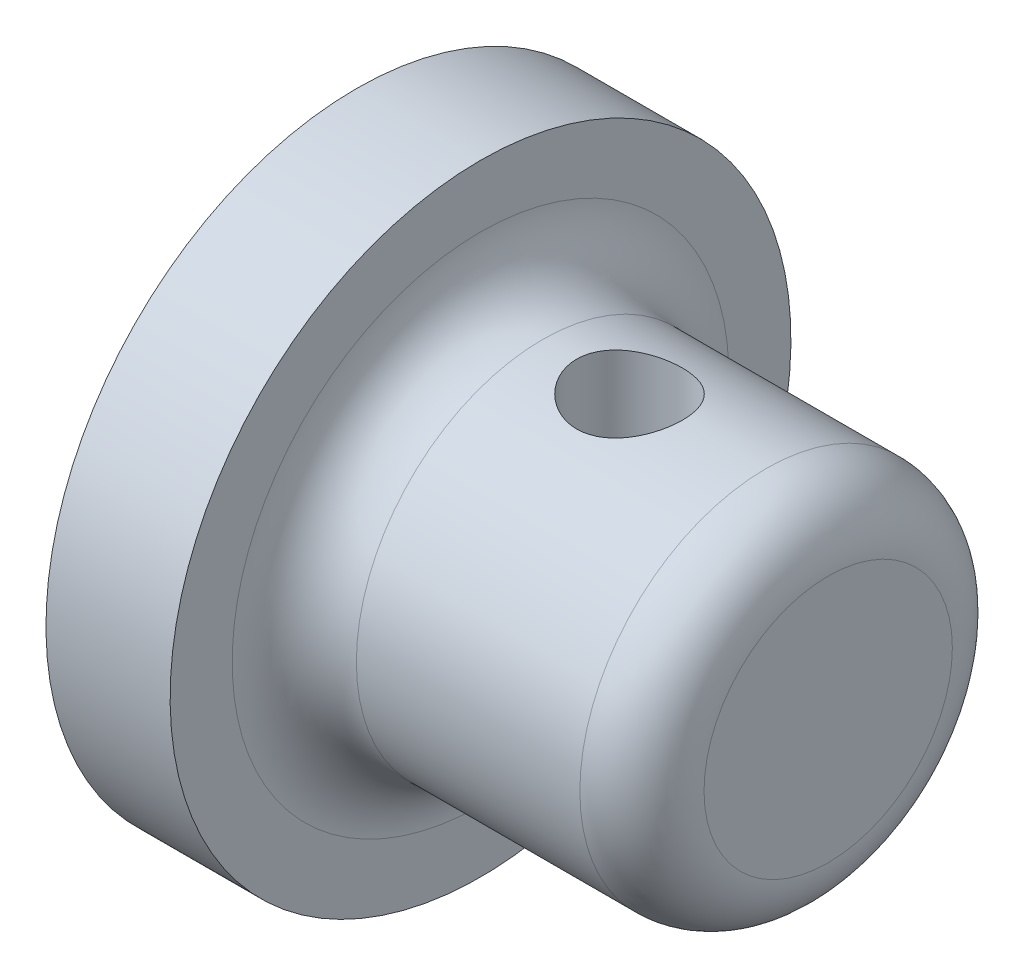
ISO-10303-21;
HEADER;
FILE_DESCRIPTION(('STEP AP214'),'2;1');
FILE_NAME('part.step','',(''),(''),'','','');
FILE_SCHEMA(('AUTOMOTIVE_DESIGN { 1 0 10303 214 1 1 1 1 }'));
ENDSEC;
DATA;
#1=APPLICATION_CONTEXT('core data for automotive mechanical design processes');
#2=APPLICATION_PROTOCOL_DEFINITION('international standard','automotive_design',2000,#1);
#3=PRODUCT_CONTEXT('',#1,'mechanical');
#4=PRODUCT('Part','Part','',(#3));
#5=PRODUCT_RELATED_PRODUCT_CATEGORY('part','',(#4));
#6=PRODUCT_DEFINITION_FORMATION('','',#4);
#7=PRODUCT_DEFINITION_CONTEXT('part definition',#1,'design');
#8=PRODUCT_DEFINITION('design','',#6,#7);
#9=PRODUCT_DEFINITION_SHAPE('','',#8);
#10=(LENGTH_UNIT() NAMED_UNIT(*) SI_UNIT(.MILLI.,.METRE.));
#11=(NAMED_UNIT(*) PLANE_ANGLE_UNIT() SI_UNIT($,.RADIAN.));
#12=(NAMED_UNIT(*) SI_UNIT($,.STERADIAN.) SOLID_ANGLE_UNIT());
#13=UNCERTAINTY_MEASURE_WITH_UNIT(LENGTH_MEASURE(1.E-05),#10,'distance_accuracy_value','');
#14=(GEOMETRIC_REPRESENTATION_CONTEXT(3) GLOBAL_UNCERTAINTY_ASSIGNED_CONTEXT((#13)) GLOBAL_UNIT_ASSIGNED_CONTEXT((#10,
#11,#12)) REPRESENTATION_CONTEXT('',''));
#15=CARTESIAN_POINT('',(0.,0.,0.));
#16=DIRECTION('',(0.,0.,1.));
#17=DIRECTION('',(1.,0.,0.));
#18=AXIS2_PLACEMENT_3D('',#15,#16,#17);
#19=CARTESIAN_POINT('',(24.13,6.34999999999998,0.));
#20=DIRECTION('',(1.,0.,0.));
#21=DIRECTION('',(0.,1.,0.));
#22=AXIS2_PLACEMENT_3D('',#19,#20,#21);
#23=PLANE('',#22);
#24=CARTESIAN_POINT('',(24.13,0.,0.));
#25=DIRECTION('',(1.,0.,0.));
#26=DIRECTION('',(0.,1.,0.));
#27=AXIS2_PLACEMENT_3D('',#24,#25,#26);
#28=CIRCLE('',#27,6.34999999999998);
#29=CARTESIAN_POINT('',(24.13,6.34999999999998,0.));
#30=VERTEX_POINT('',#29);
#31=EDGE_CURVE('E13',#30,#30,#28,.T.);
#32=ORIENTED_EDGE('',*,*,#31,.T.);
#33=EDGE_LOOP('',(#32));
#34=FACE_BOUND('',#33,.T.);
#35=ADVANCED_FACE('F59',(#34),#23,.T.);
#36=CARTESIAN_POINT('',(20.955,0.,0.));
#37=DIRECTION('',(1.,0.,0.));
#38=DIRECTION('',(0.,1.,0.));
#39=AXIS2_PLACEMENT_3D('',#36,#37,#38);
#40=TOROIDAL_SURFACE('',#39,6.35,3.175);
#41=CARTESIAN_POINT('',(20.955,0.,0.));
#42=DIRECTION('',(1.,0.,0.));
#43=DIRECTION('',(0.,1.,0.));
#44=AXIS2_PLACEMENT_3D('',#41,#42,#43);
#45=CIRCLE('',#44,9.525);
#46=CARTESIAN_POINT('',(20.955,9.525,0.));
#47=VERTEX_POINT('',#46);
#48=EDGE_CURVE('E66',#47,#47,#45,.T.);
#49=ORIENTED_EDGE('',*,*,#48,.T.);
#50=EDGE_LOOP('',(#49));
#51=FACE_BOUND('',#50,.T.);
#52=ORIENTED_EDGE('',*,*,#31,.F.);
#53=EDGE_LOOP('',(#52));
#54=FACE_BOUND('',#53,.T.);
#55=ADVANCED_FACE('F122',(#51,#54),#40,.T.);
#56=CARTESIAN_POINT('',(24.13,0.,0.));
#57=DIRECTION('',(1.,0.,0.));
#58=DIRECTION('',(0.,1.,0.));
#59=AXIS2_PLACEMENT_3D('',#56,#57,#58);
#60=CYLINDRICAL_SURFACE('',#59,9.525);
#61=CARTESIAN_POINT('',(11.2649,9.525,0.));
#62=CARTESIAN_POINT('',(11.2649027139598,9.52499818112442,0.148756999916294));
#63=CARTESIAN_POINT('',(11.2772114442681,9.52148136829678,0.297541994727331));
#64=CARTESIAN_POINT('',(11.3260190434138,9.50779462426993,0.590802096886819));
#65=CARTESIAN_POINT('',(11.3625272951013,9.49762211248473,0.735275509796205));
#66=CARTESIAN_POINT('',(11.4584334056819,9.47174264412805,1.0156387449244));
#67=CARTESIAN_POINT('',(11.5177995709198,9.45604335328707,1.15154015034689));
#68=CARTESIAN_POINT('',(11.6576124363739,9.420755493562,1.41145912819135));
#69=CARTESIAN_POINT('',(11.7380612700519,9.40116653111099,1.53547549617066));
#70=CARTESIAN_POINT('',(11.9199625804458,9.3596317541851,1.77132902249801));
#71=CARTESIAN_POINT('',(12.0218625411715,9.33764151138462,1.88281322947987));
#72=CARTESIAN_POINT('',(12.2428184677557,9.29405743568324,2.08736237812629));
#73=CARTESIAN_POINT('',(12.3618769662972,9.2724636618345,2.18042459579446));
#74=CARTESIAN_POINT('',(12.6166729651115,9.23165527466383,2.34727748753855));
#75=CARTESIAN_POINT('',(12.7526942782538,9.21249630041467,2.42064963199244));
#76=CARTESIAN_POINT('',(13.0357757661025,9.17938552638479,2.54333897551483));
#77=CARTESIAN_POINT('',(13.1828335902785,9.16543262158652,2.59266127997999));
#78=CARTESIAN_POINT('',(13.4798762040959,9.14477466733228,2.6646012440702));
#79=CARTESIAN_POINT('',(13.6296921910612,9.13789478730722,2.68786440724308));
#80=CARTESIAN_POINT('',(13.9312462879286,9.13164060874917,2.7090399283611));
#81=CARTESIAN_POINT('',(14.0829839787247,9.132264700897,2.70695772193142));
#82=CARTESIAN_POINT('',(14.3789311439594,9.14079224375529,2.67801129612543));
#83=CARTESIAN_POINT('',(14.5232261747384,9.14846222605159,2.65194185845393));
#84=CARTESIAN_POINT('',(14.8053044207535,9.16984154965303,2.57703957452235));
#85=CARTESIAN_POINT('',(14.943087052398,9.18355143107613,2.52820469243981));
#86=CARTESIAN_POINT('',(15.2102360733593,9.21566137412121,2.40854203178749));
#87=CARTESIAN_POINT('',(15.3394753327523,9.23411806676774,2.33744627513731));
#88=CARTESIAN_POINT('',(15.5844619632318,9.27361322961474,2.17546656004989));
#89=CARTESIAN_POINT('',(15.7002063537613,9.2946522680691,2.08457824277424));
#90=CARTESIAN_POINT('',(15.9194423672558,9.33790080178231,1.8815885139358));
#91=CARTESIAN_POINT('',(16.0223177311978,9.36012471798654,1.76882355323714));
#92=CARTESIAN_POINT('',(16.207832824048,9.40254107733199,1.52736701366854));
#93=CARTESIAN_POINT('',(16.2904715290635,9.42273341765329,1.39867462943139));
#94=CARTESIAN_POINT('',(16.433490103816,9.45896471925581,1.1279784427516));
#95=CARTESIAN_POINT('',(16.49374574329,9.47498035703894,0.985905676513321));
#96=CARTESIAN_POINT('',(16.589332503177,9.50088562646572,0.693085150649756));
#97=CARTESIAN_POINT('',(16.6246698280466,9.51077678298027,0.542339560604574));
#98=CARTESIAN_POINT('',(16.6684198116526,9.52308262952376,0.241701393809074));
#99=CARTESIAN_POINT('',(16.6776689361307,9.52572950732462,0.0919398616075997));
#100=CARTESIAN_POINT('',(16.671307437029,9.52392301879463,-0.206999132800684));
#101=CARTESIAN_POINT('',(16.6556997576006,9.5194704933489,-0.356176662081515));
#102=CARTESIAN_POINT('',(16.6007492351058,9.50411657709512,-0.646640666342629));
#103=CARTESIAN_POINT('',(16.5618842009488,9.49334509107229,-0.788025041101639));
#104=CARTESIAN_POINT('',(16.4620871647328,9.46658636482631,-1.06224499178383));
#105=CARTESIAN_POINT('',(16.4011526239624,9.4505985245737,-1.19507958213246));
#106=CARTESIAN_POINT('',(16.2574701150544,9.41465087528733,-1.45159254029374));
#107=CARTESIAN_POINT('',(16.1742819843645,9.39461317210824,-1.57501315692875));
#108=CARTESIAN_POINT('',(15.9889974220595,9.3528753240453,-1.80643255452915));
#109=CARTESIAN_POINT('',(15.8868967411297,9.33117480620021,-1.91442786002367));
#110=CARTESIAN_POINT('',(15.6627657332477,9.28768360367916,-2.11553781936395));
#111=CARTESIAN_POINT('',(15.5401983484355,9.26591263188579,-2.20805940209002));
#112=CARTESIAN_POINT('',(15.2808083794733,9.22550255819343,-2.37124887253828));
#113=CARTESIAN_POINT('',(15.1439863032124,9.20686334477291,-2.44191753851558));
#114=CARTESIAN_POINT('',(14.860551369766,9.17504490312454,-2.55887729952463));
#115=CARTESIAN_POINT('',(14.7139958856797,9.16183649519369,-2.60529904736666));
#116=CARTESIAN_POINT('',(14.414711630276,9.14240513059007,-2.67269664138985));
#117=CARTESIAN_POINT('',(14.261984715707,9.13618008886282,-2.69368008294949));
#118=CARTESIAN_POINT('',(13.9608086707336,9.13161059173126,-2.70912698738763));
#119=CARTESIAN_POINT('',(13.8124124060783,9.13298091418602,-2.70455023979921));
#120=CARTESIAN_POINT('',(13.518600247693,9.14277082269786,-2.67126583333857));
#121=CARTESIAN_POINT('',(13.3731842568879,9.15119017877477,-2.64255896173012));
#122=CARTESIAN_POINT('',(13.0908506701345,9.17394849705862,-2.56241876389195));
#123=CARTESIAN_POINT('',(12.9538628855709,9.18822769726058,-2.51121451658372));
#124=CARTESIAN_POINT('',(12.6903147521363,9.22109158095282,-2.38771023523766));
#125=CARTESIAN_POINT('',(12.5637562352128,9.23967701867681,-2.31540650506774));
#126=CARTESIAN_POINT('',(12.3201417894333,9.27982563938383,-2.14895545224544));
#127=CARTESIAN_POINT('',(12.2035376950314,9.30146689026007,-2.0541656218296));
#128=CARTESIAN_POINT('',(11.9875795456067,9.34488283001816,-1.84662174734086));
#129=CARTESIAN_POINT('',(11.8882298263015,9.36665755101969,-1.73386320165934));
#130=CARTESIAN_POINT('',(11.7071164822866,9.40854540303318,-1.49015020654805));
#131=CARTESIAN_POINT('',(11.6258601898975,9.42860270326483,-1.35880823337262));
#132=CARTESIAN_POINT('',(11.4867044832368,9.46415696389063,-1.08375849706931));
#133=CARTESIAN_POINT('',(11.4287920952713,9.47965645604969,-0.940057656585436));
#134=CARTESIAN_POINT('',(11.3443402063547,9.50267006063013,-0.664364906766963));
#135=CARTESIAN_POINT('',(11.3146249825079,9.51097871542354,-0.533404088989212));
#136=CARTESIAN_POINT('',(11.274904938873,9.52214415033941,-0.268302827001871));
#137=CARTESIAN_POINT('',(11.2648975523005,9.52500164042996,-0.134162799161774));
#138=CARTESIAN_POINT('',(11.2649,9.525,0.));
#139=B_SPLINE_CURVE_WITH_KNOTS('',3,(#61,#62,#63,#64,#65,#66,#67,#68,#69,#70,#71,#72,#73,#74,
#75,#76,#77,#78,#79,#80,#81,#82,#83,#84,#85,#86,#87,#88,#89,#90,#91,#92,#93,#94,#95,#96,#97,#98,
#99,#100,#101,#102,#103,#104,#105,#106,#107,#108,#109,#110,#111,#112,#113,#114,#115,#116,#117,
#118,#119,#120,#121,#122,#123,#124,#125,#126,#127,#128,#129,#130,#131,#132,#133,#134,#135,#136,
#137,#138),.UNSPECIFIED.,.T.,.F.,(4,2,2,2,2,2,2,2,2,2,2,2,2,2,2,2,2,2,2,2,2,2,2,2,2,2,2,2,2,2,2,
2,2,2,2,2,2,2,4),(0.,0.445778588608764,0.891730119570487,1.33706552998242,1.78244602355233,
2.23824969509093,2.69412071449328,3.1590272915526,3.62383513336237,4.07685555606772,
4.52977882470262,4.9682153636813,5.40669111780621,5.85066253981491,6.29473183497442,
6.75532655956679,7.2159445835686,7.67908222414913,8.14210450648873,8.59010226811034,
9.03804697081134,9.47709047830543,9.91618450613636,10.3647039776081,10.8133243459561,
11.2764301365973,11.7395194326002,12.2000869695865,12.660516956259,13.1037768089245,
13.5470222004591,13.9858552333413,14.4247651856217,14.8781696564047,15.3316878953407,
15.7966563015891,16.2613659378204,16.663462606734,17.0655069023826),.UNSPECIFIED.);
#140=CARTESIAN_POINT('',(11.2649,9.525,0.));
#141=VERTEX_POINT('',#140);
#142=EDGE_CURVE('E99',#141,#141,#139,.T.);
#143=ORIENTED_EDGE('',*,*,#142,.F.);
#144=EDGE_LOOP('',(#143));
#145=FACE_BOUND('',#144,.T.);
#146=CARTESIAN_POINT('',(9.52500000000002,0.,0.));
#147=DIRECTION('',(1.,0.,0.));
#148=DIRECTION('',(0.,1.,0.));
#149=AXIS2_PLACEMENT_3D('',#146,#147,#148);
#150=CIRCLE('',#149,9.525);
#151=CARTESIAN_POINT('',(9.52500000000002,9.525,0.));
#152=VERTEX_POINT('',#151);
#153=EDGE_CURVE('E117',#152,#152,#150,.T.);
#154=ORIENTED_EDGE('',*,*,#153,.T.);
#155=EDGE_LOOP('',(#154));
#156=FACE_BOUND('',#155,.T.);
#157=ORIENTED_EDGE('',*,*,#48,.F.);
#158=EDGE_LOOP('',(#157));
#159=FACE_BOUND('',#158,.T.);
#160=ADVANCED_FACE('F125',(#145,#156,#159),#60,.T.);
#161=CARTESIAN_POINT('',(9.525,0.,0.));
#162=DIRECTION('',(1.,0.,0.));
#163=DIRECTION('',(0.,1.,0.));
#164=AXIS2_PLACEMENT_3D('',#161,#162,#163);
#165=TOROIDAL_SURFACE('',#164,12.7,3.175);
#166=CARTESIAN_POINT('',(6.35,0.,0.));
#167=DIRECTION('',(1.,0.,0.));
#168=DIRECTION('',(0.,1.,0.));
#169=AXIS2_PLACEMENT_3D('',#166,#167,#168);
#170=CIRCLE('',#169,12.7);
#171=CARTESIAN_POINT('',(6.35,12.7,0.));
#172=VERTEX_POINT('',#171);
#173=EDGE_CURVE('E114',#172,#172,#170,.T.);
#174=ORIENTED_EDGE('',*,*,#173,.T.);
#175=EDGE_LOOP('',(#174));
#176=FACE_BOUND('',#175,.T.);
#177=ORIENTED_EDGE('',*,*,#153,.F.);
#178=EDGE_LOOP('',(#177));
#179=FACE_BOUND('',#178,.T.);
#180=ADVANCED_FACE('F127',(#176,#179),#165,.F.);
#181=CARTESIAN_POINT('',(6.35,15.875,0.));
#182=DIRECTION('',(1.,0.,0.));
#183=DIRECTION('',(0.,1.,0.));
#184=AXIS2_PLACEMENT_3D('',#181,#182,#183);
#185=PLANE('',#184);
#186=CARTESIAN_POINT('',(6.35,0.,0.));
#187=DIRECTION('',(1.,0.,0.));
#188=DIRECTION('',(0.,1.,0.));
#189=AXIS2_PLACEMENT_3D('',#186,#187,#188);
#190=CIRCLE('',#189,15.875);
#191=CARTESIAN_POINT('',(6.35,15.875,0.));
#192=VERTEX_POINT('',#191);
#193=EDGE_CURVE('E111',#192,#192,#190,.T.);
#194=ORIENTED_EDGE('',*,*,#193,.T.);
#195=EDGE_LOOP('',(#194));
#196=FACE_BOUND('',#195,.T.);
#197=ORIENTED_EDGE('',*,*,#173,.F.);
#198=EDGE_LOOP('',(#197));
#199=FACE_BOUND('',#198,.T.);
#200=ADVANCED_FACE('F135',(#196,#199),#185,.T.);
#201=CARTESIAN_POINT('',(24.13,0.,0.));
#202=DIRECTION('',(1.,0.,0.));
#203=DIRECTION('',(0.,1.,0.));
#204=AXIS2_PLACEMENT_3D('',#201,#202,#203);
#205=CYLINDRICAL_SURFACE('',#204,15.875);
#206=CARTESIAN_POINT('',(0.,0.,0.));
#207=DIRECTION('',(1.,0.,0.));
#208=DIRECTION('',(0.,1.,0.));
#209=AXIS2_PLACEMENT_3D('',#206,#207,#208);
#210=CIRCLE('',#209,15.875);
#211=CARTESIAN_POINT('',(0.,15.875,0.));
#212=VERTEX_POINT('',#211);
#213=EDGE_CURVE('E89',#212,#212,#210,.T.);
#214=ORIENTED_EDGE('',*,*,#213,.T.);
#215=EDGE_LOOP('',(#214));
#216=FACE_BOUND('',#215,.T.);
#217=ORIENTED_EDGE('',*,*,#193,.F.);
#218=EDGE_LOOP('',(#217));
#219=FACE_BOUND('',#218,.T.);
#220=ADVANCED_FACE('F165',(#216,#219),#205,.T.);
#221=CARTESIAN_POINT('',(0.,0.,0.));
#222=DIRECTION('',(-1.,0.,0.));
#223=DIRECTION('',(0.,-1.,0.));
#224=AXIS2_PLACEMENT_3D('',#221,#222,#223);
#225=PLANE('',#224);
#226=CARTESIAN_POINT('',(0.,0.,0.));
#227=DIRECTION('',(-1.,0.,0.));
#228=DIRECTION('',(0.,-1.,0.));
#229=AXIS2_PLACEMENT_3D('',#226,#227,#228);
#230=CIRCLE('',#229,4.8895);
#231=CARTESIAN_POINT('',(0.,3.429,-3.48556584358982));
#232=VERTEX_POINT('',#231);
#233=CARTESIAN_POINT('',(0.,3.429,3.48556584358982));
#234=VERTEX_POINT('',#233);
#235=EDGE_CURVE('E73',#232,#234,#230,.T.);
#236=ORIENTED_EDGE('',*,*,#235,.F.);
#237=DIRECTION('',(0.,0.,-1.));
#238=VECTOR('',#237,1.);
#239=CARTESIAN_POINT('',(0.,3.429,-3.48556584358982));
#240=LINE('',#239,#238);
#241=EDGE_CURVE('E93',#234,#232,#240,.T.);
#242=ORIENTED_EDGE('',*,*,#241,.F.);
#243=EDGE_LOOP('',(#236,#242));
#244=FACE_BOUND('',#243,.T.);
#245=ORIENTED_EDGE('',*,*,#213,.F.);
#246=EDGE_LOOP('',(#245));
#247=FACE_BOUND('',#246,.T.);
#248=ADVANCED_FACE('F97',(#244,#247),#225,.T.);
#249=CARTESIAN_POINT('',(19.304,0.,0.));
#250=DIRECTION('',(-1.,0.,0.));
#251=DIRECTION('',(0.,-1.,0.));
#252=AXIS2_PLACEMENT_3D('',#249,#250,#251);
#253=CYLINDRICAL_SURFACE('',#252,4.8895);
#254=ORIENTED_EDGE('',*,*,#235,.T.);
#255=DIRECTION('',(-1.,0.,0.));
#256=VECTOR('',#255,1.);
#257=CARTESIAN_POINT('',(19.304,3.429,3.48556584358982));
#258=LINE('',#257,#256);
#259=CARTESIAN_POINT('',(19.304,3.429,3.48556584358982));
#260=VERTEX_POINT('',#259);
#261=EDGE_CURVE('E90',#260,#234,#258,.T.);
#262=ORIENTED_EDGE('',*,*,#261,.F.);
#263=CARTESIAN_POINT('',(19.304,0.,0.));
#264=DIRECTION('',(-1.,0.,0.));
#265=DIRECTION('',(0.,-1.,0.));
#266=AXIS2_PLACEMENT_3D('',#263,#264,#265);
#267=CIRCLE('',#266,4.8895);
#268=CARTESIAN_POINT('',(19.304,3.429,-3.48556584358982));
#269=VERTEX_POINT('',#268);
#270=EDGE_CURVE('E87',#269,#260,#267,.T.);
#271=ORIENTED_EDGE('',*,*,#270,.F.);
#272=DIRECTION('',(-1.,0.,0.));
#273=VECTOR('',#272,1.);
#274=CARTESIAN_POINT('',(19.304,3.429,-3.48556584358982));
#275=LINE('',#274,#273);
#276=EDGE_CURVE('E81',#269,#232,#275,.T.);
#277=ORIENTED_EDGE('',*,*,#276,.T.);
#278=EDGE_LOOP('',(#254,#262,#271,#277));
#279=FACE_BOUND('',#278,.T.);
#280=ADVANCED_FACE('F85',(#279),#253,.F.);
#281=CARTESIAN_POINT('',(19.304,3.429,-3.48556584358982));
#282=DIRECTION('',(0.,1.,0.));
#283=DIRECTION('',(-1.,0.,0.));
#284=AXIS2_PLACEMENT_3D('',#281,#282,#283);
#285=PLANE('',#284);
#286=CARTESIAN_POINT('',(13.97,3.429,0.));
#287=DIRECTION('',(0.,1.,0.));
#288=DIRECTION('',(-1.,0.,0.));
#289=AXIS2_PLACEMENT_3D('',#286,#287,#288);
#290=CIRCLE('',#289,2.70509999999999);
#291=CARTESIAN_POINT('',(11.2649,3.429,0.));
#292=VERTEX_POINT('',#291);
#293=EDGE_CURVE('E102',#292,#292,#290,.T.);
#294=ORIENTED_EDGE('',*,*,#293,.T.);
#295=EDGE_LOOP('',(#294));
#296=FACE_BOUND('',#295,.T.);
#297=ORIENTED_EDGE('',*,*,#241,.T.);
#298=ORIENTED_EDGE('',*,*,#276,.F.);
#299=DIRECTION('',(0.,0.,-1.));
#300=VECTOR('',#299,1.);
#301=CARTESIAN_POINT('',(19.304,3.429,-3.48556584358982));
#302=LINE('',#301,#300);
#303=EDGE_CURVE('E105',#260,#269,#302,.T.);
#304=ORIENTED_EDGE('',*,*,#303,.F.);
#305=ORIENTED_EDGE('',*,*,#261,.T.);
#306=EDGE_LOOP('',(#297,#298,#304,#305));
#307=FACE_BOUND('',#306,.T.);
#308=ADVANCED_FACE('F94',(#296,#307),#285,.F.);
#309=CARTESIAN_POINT('',(19.304,0.,0.));
#310=DIRECTION('',(-1.,0.,0.));
#311=DIRECTION('',(0.,-1.,0.));
#312=AXIS2_PLACEMENT_3D('',#309,#310,#311);
#313=PLANE('',#312);
#314=ORIENTED_EDGE('',*,*,#270,.T.);
#315=ORIENTED_EDGE('',*,*,#303,.T.);
#316=EDGE_LOOP('',(#314,#315));
#317=FACE_BOUND('',#316,.T.);
#318=ADVANCED_FACE('F194',(#317),#313,.T.);
#319=CARTESIAN_POINT('',(13.97,9.525,0.));
#320=DIRECTION('',(0.,1.,0.));
#321=DIRECTION('',(0.,0.,1.));
#322=AXIS2_PLACEMENT_3D('',#319,#320,#321);
#323=CYLINDRICAL_SURFACE('',#322,2.70509999999999);
#324=ORIENTED_EDGE('',*,*,#142,.T.);
#325=EDGE_LOOP('',(#324));
#326=FACE_BOUND('',#325,.T.);
#327=ORIENTED_EDGE('',*,*,#293,.F.);
#328=EDGE_LOOP('',(#327));
#329=FACE_BOUND('',#328,.T.);
#330=ADVANCED_FACE('F197',(#326,#329),#323,.F.);
#331=CLOSED_SHELL('',(#35,#55,#160,#180,#200,#220,#248,#280,#308,#318,#330));
#332=MANIFOLD_SOLID_BREP('B2',#331);
#333=ADVANCED_BREP_SHAPE_REPRESENTATION('',(#18,#332),#14);
#334=SHAPE_DEFINITION_REPRESENTATION(#9,#333);
ENDSEC;
END-ISO-10303-21;
